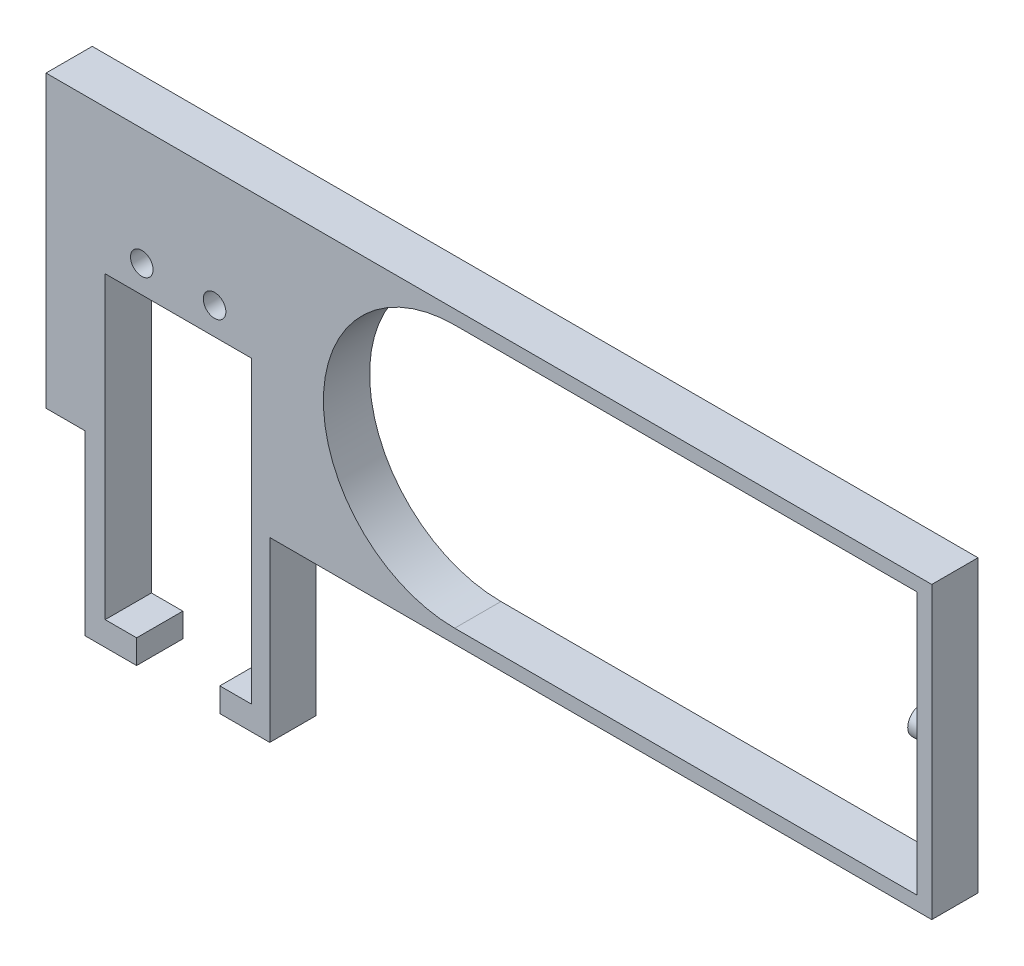
ISO-10303-21;
HEADER;
FILE_DESCRIPTION(('STEP AP214'),'2;1');
FILE_NAME('part.step','',(''),(''),'','','');
FILE_SCHEMA(('AUTOMOTIVE_DESIGN { 1 0 10303 214 1 1 1 1 }'));
ENDSEC;
DATA;
#1=APPLICATION_CONTEXT('core data for automotive mechanical design processes');
#2=APPLICATION_PROTOCOL_DEFINITION('international standard','automotive_design',2000,#1);
#3=PRODUCT_CONTEXT('',#1,'mechanical');
#4=PRODUCT('Part','Part','',(#3));
#5=PRODUCT_RELATED_PRODUCT_CATEGORY('part','',(#4));
#6=PRODUCT_DEFINITION_FORMATION('','',#4);
#7=PRODUCT_DEFINITION_CONTEXT('part definition',#1,'design');
#8=PRODUCT_DEFINITION('design','',#6,#7);
#9=PRODUCT_DEFINITION_SHAPE('','',#8);
#10=(LENGTH_UNIT() NAMED_UNIT(*) SI_UNIT(.MILLI.,.METRE.));
#11=(NAMED_UNIT(*) PLANE_ANGLE_UNIT() SI_UNIT($,.RADIAN.));
#12=(NAMED_UNIT(*) SI_UNIT($,.STERADIAN.) SOLID_ANGLE_UNIT());
#13=UNCERTAINTY_MEASURE_WITH_UNIT(LENGTH_MEASURE(1.E-05),#10,'distance_accuracy_value','');
#14=(GEOMETRIC_REPRESENTATION_CONTEXT(3) GLOBAL_UNCERTAINTY_ASSIGNED_CONTEXT((#13)) GLOBAL_UNIT_ASSIGNED_CONTEXT((#10,
#11,#12)) REPRESENTATION_CONTEXT('',''));
#15=CARTESIAN_POINT('',(0.,0.,0.));
#16=DIRECTION('',(0.,0.,1.));
#17=DIRECTION('',(1.,0.,0.));
#18=AXIS2_PLACEMENT_3D('',#15,#16,#17);
#19=CARTESIAN_POINT('',(203.2,-44.323,-51.1953367016958));
#20=DIRECTION('',(0.,-1.,0.));
#21=DIRECTION('',(0.,0.,-1.));
#22=AXIS2_PLACEMENT_3D('',#19,#20,#21);
#23=PLANE('',#22);
#24=DIRECTION('',(0.,0.,1.));
#25=VECTOR('',#24,1.);
#26=CARTESIAN_POINT('',(210.312,-44.323,0.));
#27=LINE('',#26,#25);
#28=CARTESIAN_POINT('',(210.312,-44.323,0.));
#29=VERTEX_POINT('',#28);
#30=CARTESIAN_POINT('',(210.312,-44.323,6.35));
#31=VERTEX_POINT('',#30);
#32=EDGE_CURVE('E233',#29,#31,#27,.T.);
#33=ORIENTED_EDGE('',*,*,#32,.T.);
#34=DIRECTION('',(1.,0.,0.));
#35=VECTOR('',#34,1.);
#36=CARTESIAN_POINT('',(203.2,-44.323,6.35));
#37=LINE('',#36,#35);
#38=CARTESIAN_POINT('',(203.2,-44.323,6.35));
#39=VERTEX_POINT('',#38);
#40=EDGE_CURVE('E300',#39,#31,#37,.T.);
#41=ORIENTED_EDGE('',*,*,#40,.F.);
#42=DIRECTION('',(0.,0.,1.));
#43=VECTOR('',#42,1.);
#44=CARTESIAN_POINT('',(203.2,-44.323,-51.1953367016958));
#45=LINE('',#44,#43);
#46=CARTESIAN_POINT('',(203.2,-44.323,0.));
#47=VERTEX_POINT('',#46);
#48=EDGE_CURVE('E305',#47,#39,#45,.T.);
#49=ORIENTED_EDGE('',*,*,#48,.F.);
#50=DIRECTION('',(-1.,0.,0.));
#51=VECTOR('',#50,1.);
#52=CARTESIAN_POINT('',(203.2,-44.323,0.));
#53=LINE('',#52,#51);
#54=EDGE_CURVE('E297',#29,#47,#53,.T.);
#55=ORIENTED_EDGE('',*,*,#54,.F.);
#56=EDGE_LOOP('',(#33,#41,#49,#55));
#57=FACE_BOUND('',#56,.T.);
#58=ADVANCED_FACE('F33',(#57),#23,.T.);
#59=CARTESIAN_POINT('',(226.06,-41.021,0.));
#60=DIRECTION('',(0.,-1.,0.));
#61=DIRECTION('',(0.,0.,-1.));
#62=AXIS2_PLACEMENT_3D('',#59,#60,#61);
#63=PLANE('',#62);
#64=DIRECTION('',(1.,0.,0.));
#65=VECTOR('',#64,1.);
#66=CARTESIAN_POINT('',(226.06,-41.021,6.35));
#67=LINE('',#66,#65);
#68=CARTESIAN_POINT('',(205.994,-41.021,6.35));
#69=VERTEX_POINT('',#68);
#70=CARTESIAN_POINT('',(210.312,-41.021,6.35));
#71=VERTEX_POINT('',#70);
#72=EDGE_CURVE('E262',#69,#71,#67,.T.);
#73=ORIENTED_EDGE('',*,*,#72,.T.);
#74=DIRECTION('',(0.,0.,1.));
#75=VECTOR('',#74,1.);
#76=CARTESIAN_POINT('',(210.312,-41.021,0.));
#77=LINE('',#76,#75);
#78=CARTESIAN_POINT('',(210.312,-41.021,0.));
#79=VERTEX_POINT('',#78);
#80=EDGE_CURVE('E236',#79,#71,#77,.T.);
#81=ORIENTED_EDGE('',*,*,#80,.F.);
#82=DIRECTION('',(1.,0.,0.));
#83=VECTOR('',#82,1.);
#84=CARTESIAN_POINT('',(226.06,-41.021,0.));
#85=LINE('',#84,#83);
#86=CARTESIAN_POINT('',(205.994,-41.021,0.));
#87=VERTEX_POINT('',#86);
#88=EDGE_CURVE('E269',#87,#79,#85,.T.);
#89=ORIENTED_EDGE('',*,*,#88,.F.);
#90=DIRECTION('',(0.,0.,1.));
#91=VECTOR('',#90,1.);
#92=CARTESIAN_POINT('',(205.994,-41.021,0.));
#93=LINE('',#92,#91);
#94=EDGE_CURVE('E286',#87,#69,#93,.T.);
#95=ORIENTED_EDGE('',*,*,#94,.T.);
#96=EDGE_LOOP('',(#73,#81,#89,#95));
#97=FACE_BOUND('',#96,.T.);
#98=ADVANCED_FACE('F383',(#97),#63,.F.);
#99=CARTESIAN_POINT('',(127.,-19.939,6.34999999999999));
#100=DIRECTION('',(0.,1.,0.));
#101=DIRECTION('',(0.,0.,1.));
#102=AXIS2_PLACEMENT_3D('',#99,#100,#101);
#103=PLANE('',#102);
#104=DIRECTION('',(-1.,0.,0.));
#105=VECTOR('',#104,1.);
#106=CARTESIAN_POINT('',(127.,-19.939,6.34999999999999));
#107=LINE('',#106,#105);
#108=CARTESIAN_POINT('',(203.2,-19.939,6.35));
#109=VERTEX_POINT('',#108);
#110=CARTESIAN_POINT('',(197.866,-19.939,6.35));
#111=VERTEX_POINT('',#110);
#112=EDGE_CURVE('E190',#109,#111,#107,.T.);
#113=ORIENTED_EDGE('',*,*,#112,.T.);
#114=DIRECTION('',(0.,0.,-1.));
#115=VECTOR('',#114,1.);
#116=CARTESIAN_POINT('',(197.866,-19.939,6.34999999999999));
#117=LINE('',#116,#115);
#118=CARTESIAN_POINT('',(197.866,-19.939,0.));
#119=VERTEX_POINT('',#118);
#120=EDGE_CURVE('E219',#111,#119,#117,.T.);
#121=ORIENTED_EDGE('',*,*,#120,.T.);
#122=DIRECTION('',(-1.,0.,0.));
#123=VECTOR('',#122,1.);
#124=CARTESIAN_POINT('',(127.,-19.939,0.));
#125=LINE('',#124,#123);
#126=CARTESIAN_POINT('',(203.2,-19.939,0.));
#127=VERTEX_POINT('',#126);
#128=EDGE_CURVE('E191',#127,#119,#125,.T.);
#129=ORIENTED_EDGE('',*,*,#128,.F.);
#130=DIRECTION('',(0.,0.,1.));
#131=VECTOR('',#130,1.);
#132=CARTESIAN_POINT('',(203.2,-19.939,6.34999999999999));
#133=LINE('',#132,#131);
#134=EDGE_CURVE('E41',#127,#109,#133,.T.);
#135=ORIENTED_EDGE('',*,*,#134,.T.);
#136=EDGE_LOOP('',(#113,#121,#129,#135));
#137=FACE_BOUND('',#136,.T.);
#138=ADVANCED_FACE('F204',(#137),#103,.F.);
#139=CARTESIAN_POINT('',(0.,0.,6.35));
#140=DIRECTION('',(0.,0.,1.));
#141=DIRECTION('',(1.,0.,0.));
#142=AXIS2_PLACEMENT_3D('',#139,#140,#141);
#143=PLANE('',#142);
#144=DIRECTION('',(0.,1.,0.));
#145=VECTOR('',#144,1.);
#146=CARTESIAN_POINT('',(197.866,33.0005445781988,6.35));
#147=LINE('',#146,#145);
#148=CARTESIAN_POINT('',(197.866,19.939,6.35));
#149=VERTEX_POINT('',#148);
#150=EDGE_CURVE('E48',#111,#149,#147,.T.);
#151=ORIENTED_EDGE('',*,*,#150,.F.);
#152=ORIENTED_EDGE('',*,*,#112,.F.);
#153=DIRECTION('',(0.,-1.,0.));
#154=VECTOR('',#153,1.);
#155=CARTESIAN_POINT('',(203.2,0.126999999999995,6.35));
#156=LINE('',#155,#154);
#157=EDGE_CURVE('E212',#109,#39,#156,.T.);
#158=ORIENTED_EDGE('',*,*,#157,.T.);
#159=ORIENTED_EDGE('',*,*,#40,.T.);
#160=DIRECTION('',(0.,-1.,0.));
#161=VECTOR('',#160,1.);
#162=CARTESIAN_POINT('',(210.312,-41.021,6.35));
#163=LINE('',#162,#161);
#164=EDGE_CURVE('E225',#71,#31,#163,.T.);
#165=ORIENTED_EDGE('',*,*,#164,.F.);
#166=ORIENTED_EDGE('',*,*,#72,.F.);
#167=DIRECTION('',(0.,-1.,0.));
#168=VECTOR('',#167,1.);
#169=CARTESIAN_POINT('',(205.994,-41.021,6.35));
#170=LINE('',#169,#168);
#171=CARTESIAN_POINT('',(205.994,0.126999999999995,6.35));
#172=VERTEX_POINT('',#171);
#173=EDGE_CURVE('E277',#172,#69,#170,.T.);
#174=ORIENTED_EDGE('',*,*,#173,.F.);
#175=DIRECTION('',(-1.,0.,0.));
#176=VECTOR('',#175,1.);
#177=CARTESIAN_POINT('',(226.06,0.126999999999998,6.35));
#178=LINE('',#177,#176);
#179=CARTESIAN_POINT('',(226.06,0.126999999999998,6.35));
#180=VERTEX_POINT('',#179);
#181=EDGE_CURVE('E274',#180,#172,#178,.T.);
#182=ORIENTED_EDGE('',*,*,#181,.F.);
#183=DIRECTION('',(0.,1.,0.));
#184=VECTOR('',#183,1.);
#185=CARTESIAN_POINT('',(226.06,-41.021,6.35));
#186=LINE('',#185,#184);
#187=CARTESIAN_POINT('',(226.06,-41.021,6.35));
#188=VERTEX_POINT('',#187);
#189=EDGE_CURVE('E249',#188,#180,#186,.T.);
#190=ORIENTED_EDGE('',*,*,#189,.F.);
#191=CARTESIAN_POINT('',(221.742,-41.021,6.35));
#192=VERTEX_POINT('',#191);
#193=EDGE_CURVE('E280',#192,#188,#67,.T.);
#194=ORIENTED_EDGE('',*,*,#193,.F.);
#195=DIRECTION('',(0.,1.,0.));
#196=VECTOR('',#195,1.);
#197=CARTESIAN_POINT('',(221.742,-41.021,6.35));
#198=LINE('',#197,#196);
#199=CARTESIAN_POINT('',(221.742,-44.323,6.35));
#200=VERTEX_POINT('',#199);
#201=EDGE_CURVE('E230',#200,#192,#198,.T.);
#202=ORIENTED_EDGE('',*,*,#201,.F.);
#203=CARTESIAN_POINT('',(228.6,-44.323,6.35));
#204=VERTEX_POINT('',#203);
#205=EDGE_CURVE('E299',#200,#204,#37,.T.);
#206=ORIENTED_EDGE('',*,*,#205,.T.);
#207=DIRECTION('',(0.,1.,0.));
#208=VECTOR('',#207,1.);
#209=CARTESIAN_POINT('',(228.6,0.126999999999995,6.35));
#210=LINE('',#209,#208);
#211=CARTESIAN_POINT('',(228.6,-19.939,6.35));
#212=VERTEX_POINT('',#211);
#213=EDGE_CURVE('E302',#204,#212,#210,.T.);
#214=ORIENTED_EDGE('',*,*,#213,.T.);
#215=CARTESIAN_POINT('',(319.532,-19.939,6.35));
#216=VERTEX_POINT('',#215);
#217=EDGE_CURVE('E194',#216,#212,#107,.T.);
#218=ORIENTED_EDGE('',*,*,#217,.F.);
#219=DIRECTION('',(0.,-1.,0.));
#220=VECTOR('',#219,1.);
#221=CARTESIAN_POINT('',(319.532,19.939,6.35));
#222=LINE('',#221,#220);
#223=CARTESIAN_POINT('',(319.532,19.939,6.35));
#224=VERTEX_POINT('',#223);
#225=EDGE_CURVE('E170',#224,#216,#222,.T.);
#226=ORIENTED_EDGE('',*,*,#225,.F.);
#227=DIRECTION('',(-1.,0.,0.));
#228=VECTOR('',#227,1.);
#229=CARTESIAN_POINT('',(127.,19.939,6.35));
#230=LINE('',#229,#228);
#231=EDGE_CURVE('E216',#224,#149,#230,.T.);
#232=ORIENTED_EDGE('',*,*,#231,.T.);
#233=EDGE_LOOP('',(#151,#152,#158,#159,#165,#166,#174,#182,#190,#194,#202,#206,#214,#218,#226,#232));
#234=FACE_BOUND('',#233,.T.);
#235=CARTESIAN_POINT('',(211.021,3.88000000000004,6.35));
#236=DIRECTION('',(0.,0.,-1.));
#237=DIRECTION('',(-1.,0.,0.));
#238=AXIS2_PLACEMENT_3D('',#235,#236,#237);
#239=CIRCLE('',#238,1.54999999999999);
#240=CARTESIAN_POINT('',(209.471,3.88000000000004,6.35));
#241=VERTEX_POINT('',#240);
#242=EDGE_CURVE('E246',#241,#241,#239,.T.);
#243=ORIENTED_EDGE('',*,*,#242,.T.);
#244=EDGE_LOOP('',(#243));
#245=FACE_BOUND('',#244,.T.);
#246=CARTESIAN_POINT('',(221.021,3.88000000000004,6.35));
#247=DIRECTION('',(0.,0.,-1.));
#248=DIRECTION('',(-1.,0.,0.));
#249=AXIS2_PLACEMENT_3D('',#246,#247,#248);
#250=CIRCLE('',#249,1.54999999999999);
#251=CARTESIAN_POINT('',(219.471,3.88000000000004,6.35));
#252=VERTEX_POINT('',#251);
#253=EDGE_CURVE('E253',#252,#252,#250,.T.);
#254=ORIENTED_EDGE('',*,*,#253,.T.);
#255=EDGE_LOOP('',(#254));
#256=FACE_BOUND('',#255,.T.);
#257=DIRECTION('',(-1.,0.,0.));
#258=VECTOR('',#257,1.);
#259=CARTESIAN_POINT('',(254.,18.034,6.35));
#260=LINE('',#259,#258);
#261=CARTESIAN_POINT('',(317.5,18.034,6.35));
#262=VERTEX_POINT('',#261);
#263=CARTESIAN_POINT('',(254.,18.034,6.35));
#264=VERTEX_POINT('',#263);
#265=EDGE_CURVE('E327',#262,#264,#260,.T.);
#266=ORIENTED_EDGE('',*,*,#265,.F.);
#267=DIRECTION('',(0.,-1.,0.));
#268=VECTOR('',#267,1.);
#269=CARTESIAN_POINT('',(317.5,18.034,6.35));
#270=LINE('',#269,#268);
#271=CARTESIAN_POINT('',(317.5,-18.034,6.35));
#272=VERTEX_POINT('',#271);
#273=EDGE_CURVE('E316',#262,#272,#270,.T.);
#274=ORIENTED_EDGE('',*,*,#273,.T.);
#275=DIRECTION('',(1.,0.,0.));
#276=VECTOR('',#275,1.);
#277=CARTESIAN_POINT('',(254.,-18.034,6.35));
#278=LINE('',#277,#276);
#279=CARTESIAN_POINT('',(254.,-18.034,6.35));
#280=VERTEX_POINT('',#279);
#281=EDGE_CURVE('E333',#280,#272,#278,.T.);
#282=ORIENTED_EDGE('',*,*,#281,.F.);
#283=CARTESIAN_POINT('',(254.,0.,6.35));
#284=DIRECTION('',(0.,0.,1.));
#285=DIRECTION('',(1.,0.,0.));
#286=AXIS2_PLACEMENT_3D('',#283,#284,#285);
#287=CIRCLE('',#286,18.034);
#288=EDGE_CURVE('E341',#264,#280,#287,.T.);
#289=ORIENTED_EDGE('',*,*,#288,.F.);
#290=EDGE_LOOP('',(#266,#274,#282,#289));
#291=FACE_BOUND('',#290,.T.);
#292=ADVANCED_FACE('F209',(#234,#245,#256,#291),#143,.T.);
#293=CARTESIAN_POINT('',(0.,0.,0.));
#294=DIRECTION('',(0.,0.,1.));
#295=DIRECTION('',(1.,0.,0.));
#296=AXIS2_PLACEMENT_3D('',#293,#294,#295);
#297=PLANE('',#296);
#298=CARTESIAN_POINT('',(211.021,3.88000000000004,0.));
#299=DIRECTION('',(0.,0.,-1.));
#300=DIRECTION('',(-1.,0.,0.));
#301=AXIS2_PLACEMENT_3D('',#298,#299,#300);
#302=CIRCLE('',#301,1.54999999999999);
#303=CARTESIAN_POINT('',(209.471,3.88000000000004,0.));
#304=VERTEX_POINT('',#303);
#305=EDGE_CURVE('E250',#304,#304,#302,.T.);
#306=ORIENTED_EDGE('',*,*,#305,.F.);
#307=EDGE_LOOP('',(#306));
#308=FACE_BOUND('',#307,.T.);
#309=CARTESIAN_POINT('',(221.021,3.88000000000004,0.));
#310=DIRECTION('',(0.,0.,-1.));
#311=DIRECTION('',(-1.,0.,0.));
#312=AXIS2_PLACEMENT_3D('',#309,#310,#311);
#313=CIRCLE('',#312,1.54999999999999);
#314=CARTESIAN_POINT('',(219.471,3.88000000000004,0.));
#315=VERTEX_POINT('',#314);
#316=EDGE_CURVE('E238',#315,#315,#313,.T.);
#317=ORIENTED_EDGE('',*,*,#316,.F.);
#318=EDGE_LOOP('',(#317));
#319=FACE_BOUND('',#318,.T.);
#320=ORIENTED_EDGE('',*,*,#128,.T.);
#321=DIRECTION('',(0.,1.,0.));
#322=VECTOR('',#321,1.);
#323=CARTESIAN_POINT('',(197.866,33.0005445781988,0.));
#324=LINE('',#323,#322);
#325=CARTESIAN_POINT('',(197.866,19.939,0.));
#326=VERTEX_POINT('',#325);
#327=EDGE_CURVE('E217',#119,#326,#324,.T.);
#328=ORIENTED_EDGE('',*,*,#327,.T.);
#329=DIRECTION('',(-1.,0.,0.));
#330=VECTOR('',#329,1.);
#331=CARTESIAN_POINT('',(127.,19.939,0.));
#332=LINE('',#331,#330);
#333=CARTESIAN_POINT('',(319.532,19.939,0.));
#334=VERTEX_POINT('',#333);
#335=EDGE_CURVE('E184',#334,#326,#332,.T.);
#336=ORIENTED_EDGE('',*,*,#335,.F.);
#337=DIRECTION('',(0.,-1.,0.));
#338=VECTOR('',#337,1.);
#339=CARTESIAN_POINT('',(319.532,19.939,0.));
#340=LINE('',#339,#338);
#341=CARTESIAN_POINT('',(319.532,-19.939,0.));
#342=VERTEX_POINT('',#341);
#343=EDGE_CURVE('E55',#334,#342,#340,.T.);
#344=ORIENTED_EDGE('',*,*,#343,.T.);
#345=CARTESIAN_POINT('',(228.6,-19.939,0.));
#346=VERTEX_POINT('',#345);
#347=EDGE_CURVE('E180',#342,#346,#125,.T.);
#348=ORIENTED_EDGE('',*,*,#347,.T.);
#349=DIRECTION('',(0.,-1.,0.));
#350=VECTOR('',#349,1.);
#351=CARTESIAN_POINT('',(228.6,0.126999999999995,0.));
#352=LINE('',#351,#350);
#353=CARTESIAN_POINT('',(228.6,-44.323,0.));
#354=VERTEX_POINT('',#353);
#355=EDGE_CURVE('E292',#346,#354,#352,.T.);
#356=ORIENTED_EDGE('',*,*,#355,.T.);
#357=CARTESIAN_POINT('',(221.742,-44.323,0.));
#358=VERTEX_POINT('',#357);
#359=EDGE_CURVE('E309',#354,#358,#53,.T.);
#360=ORIENTED_EDGE('',*,*,#359,.T.);
#361=DIRECTION('',(0.,1.,0.));
#362=VECTOR('',#361,1.);
#363=CARTESIAN_POINT('',(221.742,-41.021,0.));
#364=LINE('',#363,#362);
#365=CARTESIAN_POINT('',(221.742,-41.021,0.));
#366=VERTEX_POINT('',#365);
#367=EDGE_CURVE('E229',#358,#366,#364,.T.);
#368=ORIENTED_EDGE('',*,*,#367,.T.);
#369=CARTESIAN_POINT('',(226.06,-41.021,0.));
#370=VERTEX_POINT('',#369);
#371=EDGE_CURVE('E268',#366,#370,#85,.T.);
#372=ORIENTED_EDGE('',*,*,#371,.T.);
#373=DIRECTION('',(0.,1.,0.));
#374=VECTOR('',#373,1.);
#375=CARTESIAN_POINT('',(226.06,-41.021,0.));
#376=LINE('',#375,#374);
#377=CARTESIAN_POINT('',(226.06,0.126999999999998,0.));
#378=VERTEX_POINT('',#377);
#379=EDGE_CURVE('E258',#370,#378,#376,.T.);
#380=ORIENTED_EDGE('',*,*,#379,.T.);
#381=DIRECTION('',(-1.,0.,0.));
#382=VECTOR('',#381,1.);
#383=CARTESIAN_POINT('',(226.06,0.126999999999998,0.));
#384=LINE('',#383,#382);
#385=CARTESIAN_POINT('',(205.994,0.126999999999995,0.));
#386=VERTEX_POINT('',#385);
#387=EDGE_CURVE('E261',#378,#386,#384,.T.);
#388=ORIENTED_EDGE('',*,*,#387,.T.);
#389=DIRECTION('',(0.,-1.,0.));
#390=VECTOR('',#389,1.);
#391=CARTESIAN_POINT('',(205.994,-41.021,0.));
#392=LINE('',#391,#390);
#393=EDGE_CURVE('E265',#386,#87,#392,.T.);
#394=ORIENTED_EDGE('',*,*,#393,.T.);
#395=ORIENTED_EDGE('',*,*,#88,.T.);
#396=DIRECTION('',(0.,-1.,0.));
#397=VECTOR('',#396,1.);
#398=CARTESIAN_POINT('',(210.312,-41.021,0.));
#399=LINE('',#398,#397);
#400=EDGE_CURVE('E226',#79,#29,#399,.T.);
#401=ORIENTED_EDGE('',*,*,#400,.T.);
#402=ORIENTED_EDGE('',*,*,#54,.T.);
#403=DIRECTION('',(0.,1.,0.));
#404=VECTOR('',#403,1.);
#405=CARTESIAN_POINT('',(203.2,0.126999999999995,0.));
#406=LINE('',#405,#404);
#407=EDGE_CURVE('E294',#47,#127,#406,.T.);
#408=ORIENTED_EDGE('',*,*,#407,.T.);
#409=EDGE_LOOP('',(#320,#328,#336,#344,#348,#356,#360,#368,#372,#380,#388,#394,#395,#401,#402,#408));
#410=FACE_BOUND('',#409,.T.);
#411=DIRECTION('',(0.,-1.,0.));
#412=VECTOR('',#411,1.);
#413=CARTESIAN_POINT('',(317.5,18.034,0.));
#414=LINE('',#413,#412);
#415=CARTESIAN_POINT('',(317.5,18.034,0.));
#416=VERTEX_POINT('',#415);
#417=CARTESIAN_POINT('',(317.5,-18.034,0.));
#418=VERTEX_POINT('',#417);
#419=EDGE_CURVE('E319',#416,#418,#414,.T.);
#420=ORIENTED_EDGE('',*,*,#419,.F.);
#421=DIRECTION('',(-1.,0.,0.));
#422=VECTOR('',#421,1.);
#423=CARTESIAN_POINT('',(254.,18.034,0.));
#424=LINE('',#423,#422);
#425=CARTESIAN_POINT('',(254.,18.034,0.));
#426=VERTEX_POINT('',#425);
#427=EDGE_CURVE('E330',#416,#426,#424,.T.);
#428=ORIENTED_EDGE('',*,*,#427,.T.);
#429=CARTESIAN_POINT('',(254.,0.,0.));
#430=DIRECTION('',(0.,0.,1.));
#431=DIRECTION('',(1.,0.,0.));
#432=AXIS2_PLACEMENT_3D('',#429,#430,#431);
#433=CIRCLE('',#432,18.034);
#434=CARTESIAN_POINT('',(254.,-18.034,0.));
#435=VERTEX_POINT('',#434);
#436=EDGE_CURVE('E344',#426,#435,#433,.T.);
#437=ORIENTED_EDGE('',*,*,#436,.T.);
#438=DIRECTION('',(1.,0.,0.));
#439=VECTOR('',#438,1.);
#440=CARTESIAN_POINT('',(254.,-18.034,0.));
#441=LINE('',#440,#439);
#442=EDGE_CURVE('E332',#435,#418,#441,.T.);
#443=ORIENTED_EDGE('',*,*,#442,.T.);
#444=EDGE_LOOP('',(#420,#428,#437,#443));
#445=FACE_BOUND('',#444,.T.);
#446=ADVANCED_FACE('F35',(#308,#319,#410,#445),#297,.F.);
#447=ORIENTED_EDGE('',*,*,#347,.F.);
#448=DIRECTION('',(0.,0.,1.));
#449=VECTOR('',#448,1.);
#450=CARTESIAN_POINT('',(319.532,-19.939,0.));
#451=LINE('',#450,#449);
#452=EDGE_CURVE('E167',#342,#216,#451,.T.);
#453=ORIENTED_EDGE('',*,*,#452,.T.);
#454=ORIENTED_EDGE('',*,*,#217,.T.);
#455=DIRECTION('',(0.,0.,-1.));
#456=VECTOR('',#455,1.);
#457=CARTESIAN_POINT('',(228.6,-19.939,6.34999999999999));
#458=LINE('',#457,#456);
#459=EDGE_CURVE('E189',#212,#346,#458,.T.);
#460=ORIENTED_EDGE('',*,*,#459,.T.);
#461=EDGE_LOOP('',(#447,#453,#454,#460));
#462=FACE_BOUND('',#461,.T.);
#463=ADVANCED_FACE('F187',(#462),#103,.F.);
#464=CARTESIAN_POINT('',(127.,19.939,6.35));
#465=DIRECTION('',(0.,-1.,0.));
#466=DIRECTION('',(0.,0.,-1.));
#467=AXIS2_PLACEMENT_3D('',#464,#465,#466);
#468=PLANE('',#467);
#469=ORIENTED_EDGE('',*,*,#335,.T.);
#470=DIRECTION('',(0.,0.,1.));
#471=VECTOR('',#470,1.);
#472=CARTESIAN_POINT('',(197.866,19.939,6.35));
#473=LINE('',#472,#471);
#474=EDGE_CURVE('E11',#326,#149,#473,.T.);
#475=ORIENTED_EDGE('',*,*,#474,.T.);
#476=ORIENTED_EDGE('',*,*,#231,.F.);
#477=DIRECTION('',(0.,0.,1.));
#478=VECTOR('',#477,1.);
#479=CARTESIAN_POINT('',(319.532,19.939,0.));
#480=LINE('',#479,#478);
#481=EDGE_CURVE('E174',#334,#224,#480,.T.);
#482=ORIENTED_EDGE('',*,*,#481,.F.);
#483=EDGE_LOOP('',(#469,#475,#476,#482));
#484=FACE_BOUND('',#483,.T.);
#485=ADVANCED_FACE('F349',(#484),#468,.F.);
#486=CARTESIAN_POINT('',(254.,0.,0.));
#487=DIRECTION('',(0.,0.,1.));
#488=DIRECTION('',(1.,0.,0.));
#489=AXIS2_PLACEMENT_3D('',#486,#487,#488);
#490=CYLINDRICAL_SURFACE('',#489,18.034);
#491=ORIENTED_EDGE('',*,*,#288,.T.);
#492=DIRECTION('',(0.,0.,1.));
#493=VECTOR('',#492,1.);
#494=CARTESIAN_POINT('',(254.,-18.034,0.));
#495=LINE('',#494,#493);
#496=EDGE_CURVE('E339',#435,#280,#495,.T.);
#497=ORIENTED_EDGE('',*,*,#496,.F.);
#498=ORIENTED_EDGE('',*,*,#436,.F.);
#499=DIRECTION('',(0.,0.,1.));
#500=VECTOR('',#499,1.);
#501=CARTESIAN_POINT('',(254.,18.034,0.));
#502=LINE('',#501,#500);
#503=EDGE_CURVE('E336',#426,#264,#502,.T.);
#504=ORIENTED_EDGE('',*,*,#503,.T.);
#505=EDGE_LOOP('',(#491,#497,#498,#504));
#506=FACE_BOUND('',#505,.T.);
#507=ADVANCED_FACE('F460',(#506),#490,.F.);
#508=CARTESIAN_POINT('',(254.,18.034,0.));
#509=DIRECTION('',(0.,1.,0.));
#510=DIRECTION('',(0.,0.,1.));
#511=AXIS2_PLACEMENT_3D('',#508,#509,#510);
#512=PLANE('',#511);
#513=ORIENTED_EDGE('',*,*,#427,.F.);
#514=DIRECTION('',(0.,0.,1.));
#515=VECTOR('',#514,1.);
#516=CARTESIAN_POINT('',(317.5,18.034,0.));
#517=LINE('',#516,#515);
#518=EDGE_CURVE('E325',#416,#262,#517,.T.);
#519=ORIENTED_EDGE('',*,*,#518,.T.);
#520=ORIENTED_EDGE('',*,*,#265,.T.);
#521=ORIENTED_EDGE('',*,*,#503,.F.);
#522=EDGE_LOOP('',(#513,#519,#520,#521));
#523=FACE_BOUND('',#522,.T.);
#524=ADVANCED_FACE('F592',(#523),#512,.F.);
#525=CARTESIAN_POINT('',(254.,-18.034,0.));
#526=DIRECTION('',(0.,-1.,0.));
#527=DIRECTION('',(0.,0.,-1.));
#528=AXIS2_PLACEMENT_3D('',#525,#526,#527);
#529=PLANE('',#528);
#530=ORIENTED_EDGE('',*,*,#281,.T.);
#531=DIRECTION('',(0.,0.,1.));
#532=VECTOR('',#531,1.);
#533=CARTESIAN_POINT('',(317.5,-18.034,0.));
#534=LINE('',#533,#532);
#535=EDGE_CURVE('E322',#418,#272,#534,.T.);
#536=ORIENTED_EDGE('',*,*,#535,.F.);
#537=ORIENTED_EDGE('',*,*,#442,.F.);
#538=ORIENTED_EDGE('',*,*,#496,.T.);
#539=EDGE_LOOP('',(#530,#536,#537,#538));
#540=FACE_BOUND('',#539,.T.);
#541=ADVANCED_FACE('F582',(#540),#529,.F.);
#542=CARTESIAN_POINT('',(317.5,18.034,0.));
#543=DIRECTION('',(-1.,0.,0.));
#544=DIRECTION('',(0.,0.,1.));
#545=AXIS2_PLACEMENT_3D('',#542,#543,#544);
#546=PLANE('',#545);
#547=CARTESIAN_POINT('',(317.5,0.,3.175));
#548=DIRECTION('',(-1.,0.,0.));
#549=DIRECTION('',(0.,0.,1.));
#550=AXIS2_PLACEMENT_3D('',#547,#548,#549);
#551=CIRCLE('',#550,1.905);
#552=CARTESIAN_POINT('',(317.5,0.,5.08));
#553=VERTEX_POINT('',#552);
#554=EDGE_CURVE('E312',#553,#553,#551,.T.);
#555=ORIENTED_EDGE('',*,*,#554,.F.);
#556=EDGE_LOOP('',(#555));
#557=FACE_BOUND('',#556,.T.);
#558=ORIENTED_EDGE('',*,*,#273,.F.);
#559=ORIENTED_EDGE('',*,*,#518,.F.);
#560=ORIENTED_EDGE('',*,*,#419,.T.);
#561=ORIENTED_EDGE('',*,*,#535,.T.);
#562=EDGE_LOOP('',(#558,#559,#560,#561));
#563=FACE_BOUND('',#562,.T.);
#564=ADVANCED_FACE('F572',(#557,#563),#546,.T.);
#565=CARTESIAN_POINT('',(314.96,0.,3.175));
#566=DIRECTION('',(1.,0.,0.));
#567=DIRECTION('',(0.,0.,-1.));
#568=AXIS2_PLACEMENT_3D('',#565,#566,#567);
#569=CYLINDRICAL_SURFACE('',#568,1.905);
#570=CARTESIAN_POINT('',(314.96,0.,3.175));
#571=DIRECTION('',(-1.,0.,0.));
#572=DIRECTION('',(0.,0.,1.));
#573=AXIS2_PLACEMENT_3D('',#570,#571,#572);
#574=CIRCLE('',#573,1.905);
#575=CARTESIAN_POINT('',(314.96,0.,5.08));
#576=VERTEX_POINT('',#575);
#577=EDGE_CURVE('E313',#576,#576,#574,.T.);
#578=ORIENTED_EDGE('',*,*,#577,.F.);
#579=EDGE_LOOP('',(#578));
#580=FACE_BOUND('',#579,.T.);
#581=ORIENTED_EDGE('',*,*,#554,.T.);
#582=EDGE_LOOP('',(#581));
#583=FACE_BOUND('',#582,.T.);
#584=ADVANCED_FACE('F561',(#580,#583),#569,.T.);
#585=CARTESIAN_POINT('',(314.96,0.,3.175));
#586=DIRECTION('',(-1.,0.,0.));
#587=DIRECTION('',(0.,0.,1.));
#588=AXIS2_PLACEMENT_3D('',#585,#586,#587);
#589=PLANE('',#588);
#590=ORIENTED_EDGE('',*,*,#577,.T.);
#591=EDGE_LOOP('',(#590));
#592=FACE_BOUND('',#591,.T.);
#593=ADVANCED_FACE('F415',(#592),#589,.T.);
#594=CARTESIAN_POINT('',(203.2,0.126999999999995,-51.1953367016958));
#595=DIRECTION('',(-1.,0.,0.));
#596=DIRECTION('',(0.,0.,1.));
#597=AXIS2_PLACEMENT_3D('',#594,#595,#596);
#598=PLANE('',#597);
#599=ORIENTED_EDGE('',*,*,#134,.F.);
#600=ORIENTED_EDGE('',*,*,#407,.F.);
#601=ORIENTED_EDGE('',*,*,#48,.T.);
#602=ORIENTED_EDGE('',*,*,#157,.F.);
#603=EDGE_LOOP('',(#599,#600,#601,#602));
#604=FACE_BOUND('',#603,.T.);
#605=ADVANCED_FACE('F389',(#604),#598,.T.);
#606=CARTESIAN_POINT('',(228.6,0.126999999999995,-51.1953367016958));
#607=DIRECTION('',(1.,0.,0.));
#608=DIRECTION('',(0.,1.,0.));
#609=AXIS2_PLACEMENT_3D('',#606,#607,#608);
#610=PLANE('',#609);
#611=ORIENTED_EDGE('',*,*,#459,.F.);
#612=ORIENTED_EDGE('',*,*,#213,.F.);
#613=DIRECTION('',(0.,0.,1.));
#614=VECTOR('',#613,1.);
#615=CARTESIAN_POINT('',(228.6,-44.323,-51.1953367016958));
#616=LINE('',#615,#614);
#617=EDGE_CURVE('E295',#354,#204,#616,.T.);
#618=ORIENTED_EDGE('',*,*,#617,.F.);
#619=ORIENTED_EDGE('',*,*,#355,.F.);
#620=EDGE_LOOP('',(#611,#612,#618,#619));
#621=FACE_BOUND('',#620,.T.);
#622=ADVANCED_FACE('F352',(#621),#610,.T.);
#623=DIRECTION('',(0.,0.,1.));
#624=VECTOR('',#623,1.);
#625=CARTESIAN_POINT('',(221.742,-44.323,0.));
#626=LINE('',#625,#624);
#627=EDGE_CURVE('E242',#358,#200,#626,.T.);
#628=ORIENTED_EDGE('',*,*,#627,.F.);
#629=ORIENTED_EDGE('',*,*,#359,.F.);
#630=ORIENTED_EDGE('',*,*,#617,.T.);
#631=ORIENTED_EDGE('',*,*,#205,.F.);
#632=EDGE_LOOP('',(#628,#629,#630,#631));
#633=FACE_BOUND('',#632,.T.);
#634=ADVANCED_FACE('F358',(#633),#23,.T.);
#635=CARTESIAN_POINT('',(226.06,-41.021,0.));
#636=DIRECTION('',(1.,0.,0.));
#637=DIRECTION('',(0.,0.,-1.));
#638=AXIS2_PLACEMENT_3D('',#635,#636,#637);
#639=PLANE('',#638);
#640=ORIENTED_EDGE('',*,*,#189,.T.);
#641=DIRECTION('',(0.,0.,1.));
#642=VECTOR('',#641,1.);
#643=CARTESIAN_POINT('',(226.06,0.126999999999998,0.));
#644=LINE('',#643,#642);
#645=EDGE_CURVE('E272',#378,#180,#644,.T.);
#646=ORIENTED_EDGE('',*,*,#645,.F.);
#647=ORIENTED_EDGE('',*,*,#379,.F.);
#648=DIRECTION('',(0.,0.,1.));
#649=VECTOR('',#648,1.);
#650=CARTESIAN_POINT('',(226.06,-41.021,0.));
#651=LINE('',#650,#649);
#652=EDGE_CURVE('E283',#370,#188,#651,.T.);
#653=ORIENTED_EDGE('',*,*,#652,.T.);
#654=EDGE_LOOP('',(#640,#646,#647,#653));
#655=FACE_BOUND('',#654,.T.);
#656=ADVANCED_FACE('F371',(#655),#639,.F.);
#657=ORIENTED_EDGE('',*,*,#371,.F.);
#658=DIRECTION('',(0.,0.,1.));
#659=VECTOR('',#658,1.);
#660=CARTESIAN_POINT('',(221.742,-41.021,0.));
#661=LINE('',#660,#659);
#662=EDGE_CURVE('E239',#366,#192,#661,.T.);
#663=ORIENTED_EDGE('',*,*,#662,.T.);
#664=ORIENTED_EDGE('',*,*,#193,.T.);
#665=ORIENTED_EDGE('',*,*,#652,.F.);
#666=EDGE_LOOP('',(#657,#663,#664,#665));
#667=FACE_BOUND('',#666,.T.);
#668=ADVANCED_FACE('F368',(#667),#63,.F.);
#669=CARTESIAN_POINT('',(205.994,-41.021,0.));
#670=DIRECTION('',(-1.,0.,0.));
#671=DIRECTION('',(0.,0.,1.));
#672=AXIS2_PLACEMENT_3D('',#669,#670,#671);
#673=PLANE('',#672);
#674=ORIENTED_EDGE('',*,*,#173,.T.);
#675=ORIENTED_EDGE('',*,*,#94,.F.);
#676=ORIENTED_EDGE('',*,*,#393,.F.);
#677=DIRECTION('',(0.,0.,1.));
#678=VECTOR('',#677,1.);
#679=CARTESIAN_POINT('',(205.994,0.126999999999995,0.));
#680=LINE('',#679,#678);
#681=EDGE_CURVE('E288',#386,#172,#680,.T.);
#682=ORIENTED_EDGE('',*,*,#681,.T.);
#683=EDGE_LOOP('',(#674,#675,#676,#682));
#684=FACE_BOUND('',#683,.T.);
#685=ADVANCED_FACE('F378',(#684),#673,.F.);
#686=CARTESIAN_POINT('',(226.06,0.126999999999998,0.));
#687=DIRECTION('',(0.,1.,0.));
#688=DIRECTION('',(-1.,0.,0.));
#689=AXIS2_PLACEMENT_3D('',#686,#687,#688);
#690=PLANE('',#689);
#691=ORIENTED_EDGE('',*,*,#181,.T.);
#692=ORIENTED_EDGE('',*,*,#681,.F.);
#693=ORIENTED_EDGE('',*,*,#387,.F.);
#694=ORIENTED_EDGE('',*,*,#645,.T.);
#695=EDGE_LOOP('',(#691,#692,#693,#694));
#696=FACE_BOUND('',#695,.T.);
#697=ADVANCED_FACE('F375',(#696),#690,.F.);
#698=CARTESIAN_POINT('',(221.021,3.88000000000004,6.35));
#699=DIRECTION('',(0.,0.,-1.));
#700=DIRECTION('',(-1.,0.,0.));
#701=AXIS2_PLACEMENT_3D('',#698,#699,#700);
#702=CYLINDRICAL_SURFACE('',#701,1.54999999999999);
#703=ORIENTED_EDGE('',*,*,#253,.F.);
#704=EDGE_LOOP('',(#703));
#705=FACE_BOUND('',#704,.T.);
#706=ORIENTED_EDGE('',*,*,#316,.T.);
#707=EDGE_LOOP('',(#706));
#708=FACE_BOUND('',#707,.T.);
#709=ADVANCED_FACE('F419',(#705,#708),#702,.F.);
#710=CARTESIAN_POINT('',(211.021,3.88000000000004,6.35));
#711=DIRECTION('',(0.,0.,-1.));
#712=DIRECTION('',(-1.,0.,0.));
#713=AXIS2_PLACEMENT_3D('',#710,#711,#712);
#714=CYLINDRICAL_SURFACE('',#713,1.54999999999999);
#715=ORIENTED_EDGE('',*,*,#242,.F.);
#716=EDGE_LOOP('',(#715));
#717=FACE_BOUND('',#716,.T.);
#718=ORIENTED_EDGE('',*,*,#305,.T.);
#719=EDGE_LOOP('',(#718));
#720=FACE_BOUND('',#719,.T.);
#721=ADVANCED_FACE('F425',(#717,#720),#714,.F.);
#722=CARTESIAN_POINT('',(221.742,-41.021,0.));
#723=DIRECTION('',(1.,0.,0.));
#724=DIRECTION('',(0.,0.,-1.));
#725=AXIS2_PLACEMENT_3D('',#722,#723,#724);
#726=PLANE('',#725);
#727=ORIENTED_EDGE('',*,*,#201,.T.);
#728=ORIENTED_EDGE('',*,*,#662,.F.);
#729=ORIENTED_EDGE('',*,*,#367,.F.);
#730=ORIENTED_EDGE('',*,*,#627,.T.);
#731=EDGE_LOOP('',(#727,#728,#729,#730));
#732=FACE_BOUND('',#731,.T.);
#733=ADVANCED_FACE('F362',(#732),#726,.F.);
#734=CARTESIAN_POINT('',(210.312,-41.021,0.));
#735=DIRECTION('',(-1.,0.,0.));
#736=DIRECTION('',(0.,0.,1.));
#737=AXIS2_PLACEMENT_3D('',#734,#735,#736);
#738=PLANE('',#737);
#739=ORIENTED_EDGE('',*,*,#164,.T.);
#740=ORIENTED_EDGE('',*,*,#32,.F.);
#741=ORIENTED_EDGE('',*,*,#400,.F.);
#742=ORIENTED_EDGE('',*,*,#80,.T.);
#743=EDGE_LOOP('',(#739,#740,#741,#742));
#744=FACE_BOUND('',#743,.T.);
#745=ADVANCED_FACE('F396',(#744),#738,.F.);
#746=CARTESIAN_POINT('',(319.532,19.939,0.));
#747=DIRECTION('',(-1.,0.,0.));
#748=DIRECTION('',(0.,0.,1.));
#749=AXIS2_PLACEMENT_3D('',#746,#747,#748);
#750=PLANE('',#749);
#751=ORIENTED_EDGE('',*,*,#225,.T.);
#752=ORIENTED_EDGE('',*,*,#452,.F.);
#753=ORIENTED_EDGE('',*,*,#343,.F.);
#754=ORIENTED_EDGE('',*,*,#481,.T.);
#755=EDGE_LOOP('',(#751,#752,#753,#754));
#756=FACE_BOUND('',#755,.T.);
#757=ADVANCED_FACE('F168',(#756),#750,.F.);
#758=CARTESIAN_POINT('',(197.866,33.0005445781988,0.));
#759=DIRECTION('',(1.,0.,0.));
#760=DIRECTION('',(0.,0.,-1.));
#761=AXIS2_PLACEMENT_3D('',#758,#759,#760);
#762=PLANE('',#761);
#763=ORIENTED_EDGE('',*,*,#150,.T.);
#764=ORIENTED_EDGE('',*,*,#474,.F.);
#765=ORIENTED_EDGE('',*,*,#327,.F.);
#766=ORIENTED_EDGE('',*,*,#120,.F.);
#767=EDGE_LOOP('',(#763,#764,#765,#766));
#768=FACE_BOUND('',#767,.T.);
#769=ADVANCED_FACE('F390',(#768),#762,.F.);
#770=CLOSED_SHELL('',(#58,#98,#138,#292,#446,#463,#485,#507,#524,#541,#564,#584,#593,#605,#622,
#634,#656,#668,#685,#697,#709,#721,#733,#745,#757,#769));
#771=MANIFOLD_SOLID_BREP('B2',#770);
#772=ADVANCED_BREP_SHAPE_REPRESENTATION('',(#18,#771),#14);
#773=SHAPE_DEFINITION_REPRESENTATION(#9,#772);
ENDSEC;
END-ISO-10303-21;
